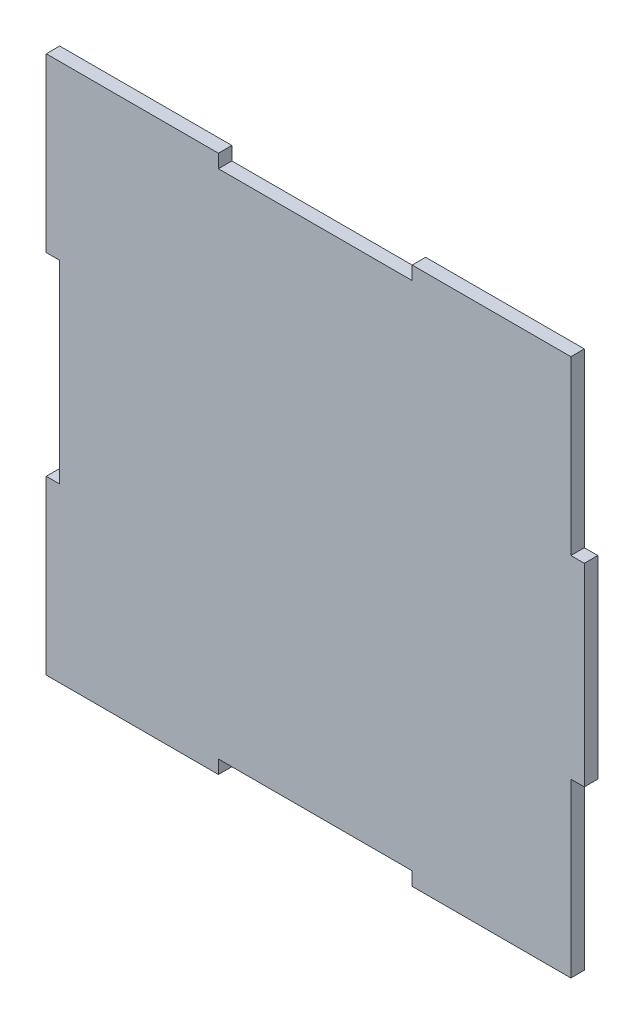
ISO-10303-21;
HEADER;
FILE_DESCRIPTION(('STEP AP214'),'2;1');
FILE_NAME('part.step','',(''),(''),'','','');
FILE_SCHEMA(('AUTOMOTIVE_DESIGN { 1 0 10303 214 1 1 1 1 }'));
ENDSEC;
DATA;
#1=APPLICATION_CONTEXT('core data for automotive mechanical design processes');
#2=APPLICATION_PROTOCOL_DEFINITION('international standard','automotive_design',2000,#1);
#3=PRODUCT_CONTEXT('',#1,'mechanical');
#4=PRODUCT('Part','Part','',(#3));
#5=PRODUCT_RELATED_PRODUCT_CATEGORY('part','',(#4));
#6=PRODUCT_DEFINITION_FORMATION('','',#4);
#7=PRODUCT_DEFINITION_CONTEXT('part definition',#1,'design');
#8=PRODUCT_DEFINITION('design','',#6,#7);
#9=PRODUCT_DEFINITION_SHAPE('','',#8);
#10=(LENGTH_UNIT() NAMED_UNIT(*) SI_UNIT(.MILLI.,.METRE.));
#11=(NAMED_UNIT(*) PLANE_ANGLE_UNIT() SI_UNIT($,.RADIAN.));
#12=(NAMED_UNIT(*) SI_UNIT($,.STERADIAN.) SOLID_ANGLE_UNIT());
#13=UNCERTAINTY_MEASURE_WITH_UNIT(LENGTH_MEASURE(1.E-05),#10,'distance_accuracy_value','');
#14=(GEOMETRIC_REPRESENTATION_CONTEXT(3) GLOBAL_UNCERTAINTY_ASSIGNED_CONTEXT((#13)) GLOBAL_UNIT_ASSIGNED_CONTEXT((#10,
#11,#12)) REPRESENTATION_CONTEXT('',''));
#15=CARTESIAN_POINT('',(0.,0.,0.));
#16=DIRECTION('',(0.,0.,1.));
#17=DIRECTION('',(1.,0.,0.));
#18=AXIS2_PLACEMENT_3D('',#15,#16,#17);
#19=CARTESIAN_POINT('',(-100.,100.,5.));
#20=DIRECTION('',(1.,0.,0.));
#21=DIRECTION('',(0.,0.,-1.));
#22=AXIS2_PLACEMENT_3D('',#19,#20,#21);
#23=PLANE('',#22);
#24=DIRECTION('',(0.,-1.,0.));
#25=VECTOR('',#24,1.);
#26=CARTESIAN_POINT('',(-100.,100.,0.));
#27=LINE('',#26,#25);
#28=CARTESIAN_POINT('',(-100.,100.,0.));
#29=VERTEX_POINT('',#28);
#30=CARTESIAN_POINT('',(-100.,36.,0.));
#31=VERTEX_POINT('',#30);
#32=EDGE_CURVE('E207',#29,#31,#27,.T.);
#33=ORIENTED_EDGE('',*,*,#32,.T.);
#34=DIRECTION('',(0.,0.,-1.));
#35=VECTOR('',#34,1.);
#36=CARTESIAN_POINT('',(-100.,36.,5.));
#37=LINE('',#36,#35);
#38=CARTESIAN_POINT('',(-100.,36.,5.));
#39=VERTEX_POINT('',#38);
#40=EDGE_CURVE('E11',#39,#31,#37,.T.);
#41=ORIENTED_EDGE('',*,*,#40,.F.);
#42=DIRECTION('',(0.,-1.,0.));
#43=VECTOR('',#42,1.);
#44=CARTESIAN_POINT('',(-100.,100.,5.));
#45=LINE('',#44,#43);
#46=CARTESIAN_POINT('',(-100.,100.,5.));
#47=VERTEX_POINT('',#46);
#48=EDGE_CURVE('E245',#47,#39,#45,.T.);
#49=ORIENTED_EDGE('',*,*,#48,.F.);
#50=DIRECTION('',(0.,0.,-1.));
#51=VECTOR('',#50,1.);
#52=CARTESIAN_POINT('',(-100.,100.,5.));
#53=LINE('',#52,#51);
#54=EDGE_CURVE('E203',#47,#29,#53,.T.);
#55=ORIENTED_EDGE('',*,*,#54,.T.);
#56=EDGE_LOOP('',(#33,#41,#49,#55));
#57=FACE_BOUND('',#56,.T.);
#58=ADVANCED_FACE('F39',(#57),#23,.F.);
#59=CARTESIAN_POINT('',(-100.,36.,5.));
#60=DIRECTION('',(0.,1.,0.));
#61=DIRECTION('',(0.,0.,1.));
#62=AXIS2_PLACEMENT_3D('',#59,#60,#61);
#63=PLANE('',#62);
#64=DIRECTION('',(1.,0.,0.));
#65=VECTOR('',#64,1.);
#66=CARTESIAN_POINT('',(-100.,36.,0.));
#67=LINE('',#66,#65);
#68=CARTESIAN_POINT('',(-95.,36.,0.));
#69=VERTEX_POINT('',#68);
#70=EDGE_CURVE('E210',#31,#69,#67,.T.);
#71=ORIENTED_EDGE('',*,*,#70,.T.);
#72=DIRECTION('',(0.,0.,-1.));
#73=VECTOR('',#72,1.);
#74=CARTESIAN_POINT('',(-95.,36.,5.));
#75=LINE('',#74,#73);
#76=CARTESIAN_POINT('',(-95.,36.,5.));
#77=VERTEX_POINT('',#76);
#78=EDGE_CURVE('E47',#77,#69,#75,.T.);
#79=ORIENTED_EDGE('',*,*,#78,.F.);
#80=DIRECTION('',(1.,0.,0.));
#81=VECTOR('',#80,1.);
#82=CARTESIAN_POINT('',(-100.,36.,5.));
#83=LINE('',#82,#81);
#84=EDGE_CURVE('E134',#39,#77,#83,.T.);
#85=ORIENTED_EDGE('',*,*,#84,.F.);
#86=ORIENTED_EDGE('',*,*,#40,.T.);
#87=EDGE_LOOP('',(#71,#79,#85,#86));
#88=FACE_BOUND('',#87,.T.);
#89=ADVANCED_FACE('F363',(#88),#63,.F.);
#90=CARTESIAN_POINT('',(-95.,36.,5.));
#91=DIRECTION('',(1.,0.,0.));
#92=DIRECTION('',(0.,0.,-1.));
#93=AXIS2_PLACEMENT_3D('',#90,#91,#92);
#94=PLANE('',#93);
#95=DIRECTION('',(0.,-1.,0.));
#96=VECTOR('',#95,1.);
#97=CARTESIAN_POINT('',(-95.,36.,0.));
#98=LINE('',#97,#96);
#99=CARTESIAN_POINT('',(-95.,-36.,0.));
#100=VERTEX_POINT('',#99);
#101=EDGE_CURVE('E212',#69,#100,#98,.T.);
#102=ORIENTED_EDGE('',*,*,#101,.T.);
#103=DIRECTION('',(0.,0.,-1.));
#104=VECTOR('',#103,1.);
#105=CARTESIAN_POINT('',(-95.,-36.,5.));
#106=LINE('',#105,#104);
#107=CARTESIAN_POINT('',(-95.,-36.,5.));
#108=VERTEX_POINT('',#107);
#109=EDGE_CURVE('E288',#108,#100,#106,.T.);
#110=ORIENTED_EDGE('',*,*,#109,.F.);
#111=DIRECTION('',(0.,-1.,0.));
#112=VECTOR('',#111,1.);
#113=CARTESIAN_POINT('',(-95.,36.,5.));
#114=LINE('',#113,#112);
#115=EDGE_CURVE('E296',#77,#108,#114,.T.);
#116=ORIENTED_EDGE('',*,*,#115,.F.);
#117=ORIENTED_EDGE('',*,*,#78,.T.);
#118=EDGE_LOOP('',(#102,#110,#116,#117));
#119=FACE_BOUND('',#118,.T.);
#120=ADVANCED_FACE('F294',(#119),#94,.F.);
#121=CARTESIAN_POINT('',(-95.,-36.,5.));
#122=DIRECTION('',(0.,-1.,0.));
#123=DIRECTION('',(0.,0.,-1.));
#124=AXIS2_PLACEMENT_3D('',#121,#122,#123);
#125=PLANE('',#124);
#126=DIRECTION('',(-1.,0.,0.));
#127=VECTOR('',#126,1.);
#128=CARTESIAN_POINT('',(-95.,-36.,0.));
#129=LINE('',#128,#127);
#130=CARTESIAN_POINT('',(-100.,-36.,0.));
#131=VERTEX_POINT('',#130);
#132=EDGE_CURVE('E214',#100,#131,#129,.T.);
#133=ORIENTED_EDGE('',*,*,#132,.T.);
#134=DIRECTION('',(0.,0.,-1.));
#135=VECTOR('',#134,1.);
#136=CARTESIAN_POINT('',(-100.,-36.,5.));
#137=LINE('',#136,#135);
#138=CARTESIAN_POINT('',(-100.,-36.,5.));
#139=VERTEX_POINT('',#138);
#140=EDGE_CURVE('E285',#139,#131,#137,.T.);
#141=ORIENTED_EDGE('',*,*,#140,.F.);
#142=DIRECTION('',(-1.,0.,0.));
#143=VECTOR('',#142,1.);
#144=CARTESIAN_POINT('',(-95.,-36.,5.));
#145=LINE('',#144,#143);
#146=EDGE_CURVE('E314',#108,#139,#145,.T.);
#147=ORIENTED_EDGE('',*,*,#146,.F.);
#148=ORIENTED_EDGE('',*,*,#109,.T.);
#149=EDGE_LOOP('',(#133,#141,#147,#148));
#150=FACE_BOUND('',#149,.T.);
#151=ADVANCED_FACE('F305',(#150),#125,.F.);
#152=CARTESIAN_POINT('',(-100.,-36.,5.));
#153=DIRECTION('',(1.,0.,0.));
#154=DIRECTION('',(0.,0.,-1.));
#155=AXIS2_PLACEMENT_3D('',#152,#153,#154);
#156=PLANE('',#155);
#157=DIRECTION('',(0.,-1.,0.));
#158=VECTOR('',#157,1.);
#159=CARTESIAN_POINT('',(-100.,-36.,0.));
#160=LINE('',#159,#158);
#161=CARTESIAN_POINT('',(-100.,-100.,0.));
#162=VERTEX_POINT('',#161);
#163=EDGE_CURVE('E216',#131,#162,#160,.T.);
#164=ORIENTED_EDGE('',*,*,#163,.T.);
#165=DIRECTION('',(0.,0.,-1.));
#166=VECTOR('',#165,1.);
#167=CARTESIAN_POINT('',(-100.,-100.,5.));
#168=LINE('',#167,#166);
#169=CARTESIAN_POINT('',(-100.,-100.,5.));
#170=VERTEX_POINT('',#169);
#171=EDGE_CURVE('E282',#170,#162,#168,.T.);
#172=ORIENTED_EDGE('',*,*,#171,.F.);
#173=DIRECTION('',(0.,-1.,0.));
#174=VECTOR('',#173,1.);
#175=CARTESIAN_POINT('',(-100.,-36.,5.));
#176=LINE('',#175,#174);
#177=EDGE_CURVE('E311',#139,#170,#176,.T.);
#178=ORIENTED_EDGE('',*,*,#177,.F.);
#179=ORIENTED_EDGE('',*,*,#140,.T.);
#180=EDGE_LOOP('',(#164,#172,#178,#179));
#181=FACE_BOUND('',#180,.T.);
#182=ADVANCED_FACE('F309',(#181),#156,.F.);
#183=CARTESIAN_POINT('',(-100.,-100.,5.));
#184=DIRECTION('',(0.,1.,0.));
#185=DIRECTION('',(0.,0.,1.));
#186=AXIS2_PLACEMENT_3D('',#183,#184,#185);
#187=PLANE('',#186);
#188=DIRECTION('',(1.,0.,0.));
#189=VECTOR('',#188,1.);
#190=CARTESIAN_POINT('',(-100.,-100.,0.));
#191=LINE('',#190,#189);
#192=CARTESIAN_POINT('',(-36.,-100.,0.));
#193=VERTEX_POINT('',#192);
#194=EDGE_CURVE('E218',#162,#193,#191,.T.);
#195=ORIENTED_EDGE('',*,*,#194,.T.);
#196=DIRECTION('',(0.,0.,-1.));
#197=VECTOR('',#196,1.);
#198=CARTESIAN_POINT('',(-36.,-100.,5.));
#199=LINE('',#198,#197);
#200=CARTESIAN_POINT('',(-36.,-100.,5.));
#201=VERTEX_POINT('',#200);
#202=EDGE_CURVE('E279',#201,#193,#199,.T.);
#203=ORIENTED_EDGE('',*,*,#202,.F.);
#204=DIRECTION('',(1.,0.,0.));
#205=VECTOR('',#204,1.);
#206=CARTESIAN_POINT('',(-100.,-100.,5.));
#207=LINE('',#206,#205);
#208=EDGE_CURVE('E313',#170,#201,#207,.T.);
#209=ORIENTED_EDGE('',*,*,#208,.F.);
#210=ORIENTED_EDGE('',*,*,#171,.T.);
#211=EDGE_LOOP('',(#195,#203,#209,#210));
#212=FACE_BOUND('',#211,.T.);
#213=ADVANCED_FACE('F376',(#212),#187,.F.);
#214=CARTESIAN_POINT('',(-36.,-100.,5.));
#215=DIRECTION('',(-1.,0.,0.));
#216=DIRECTION('',(0.,-1.,0.));
#217=AXIS2_PLACEMENT_3D('',#214,#215,#216);
#218=PLANE('',#217);
#219=DIRECTION('',(0.,1.,0.));
#220=VECTOR('',#219,1.);
#221=CARTESIAN_POINT('',(-36.,-100.,0.));
#222=LINE('',#221,#220);
#223=CARTESIAN_POINT('',(-36.,-95.,0.));
#224=VERTEX_POINT('',#223);
#225=EDGE_CURVE('E220',#193,#224,#222,.T.);
#226=ORIENTED_EDGE('',*,*,#225,.T.);
#227=DIRECTION('',(0.,0.,-1.));
#228=VECTOR('',#227,1.);
#229=CARTESIAN_POINT('',(-36.,-95.,5.));
#230=LINE('',#229,#228);
#231=CARTESIAN_POINT('',(-36.,-95.,5.));
#232=VERTEX_POINT('',#231);
#233=EDGE_CURVE('E276',#232,#224,#230,.T.);
#234=ORIENTED_EDGE('',*,*,#233,.F.);
#235=DIRECTION('',(0.,1.,0.));
#236=VECTOR('',#235,1.);
#237=CARTESIAN_POINT('',(-36.,-100.,5.));
#238=LINE('',#237,#236);
#239=EDGE_CURVE('E316',#201,#232,#238,.T.);
#240=ORIENTED_EDGE('',*,*,#239,.F.);
#241=ORIENTED_EDGE('',*,*,#202,.T.);
#242=EDGE_LOOP('',(#226,#234,#240,#241));
#243=FACE_BOUND('',#242,.T.);
#244=ADVANCED_FACE('F379',(#243),#218,.F.);
#245=CARTESIAN_POINT('',(-36.,-95.,5.));
#246=DIRECTION('',(0.,1.,0.));
#247=DIRECTION('',(0.,0.,1.));
#248=AXIS2_PLACEMENT_3D('',#245,#246,#247);
#249=PLANE('',#248);
#250=DIRECTION('',(1.,0.,0.));
#251=VECTOR('',#250,1.);
#252=CARTESIAN_POINT('',(-36.,-95.,0.));
#253=LINE('',#252,#251);
#254=CARTESIAN_POINT('',(36.,-95.,0.));
#255=VERTEX_POINT('',#254);
#256=EDGE_CURVE('E222',#224,#255,#253,.T.);
#257=ORIENTED_EDGE('',*,*,#256,.T.);
#258=DIRECTION('',(0.,0.,-1.));
#259=VECTOR('',#258,1.);
#260=CARTESIAN_POINT('',(36.,-95.,5.));
#261=LINE('',#260,#259);
#262=CARTESIAN_POINT('',(36.,-95.,5.));
#263=VERTEX_POINT('',#262);
#264=EDGE_CURVE('E273',#263,#255,#261,.T.);
#265=ORIENTED_EDGE('',*,*,#264,.F.);
#266=DIRECTION('',(1.,0.,0.));
#267=VECTOR('',#266,1.);
#268=CARTESIAN_POINT('',(-36.,-95.,5.));
#269=LINE('',#268,#267);
#270=EDGE_CURVE('E322',#232,#263,#269,.T.);
#271=ORIENTED_EDGE('',*,*,#270,.F.);
#272=ORIENTED_EDGE('',*,*,#233,.T.);
#273=EDGE_LOOP('',(#257,#265,#271,#272));
#274=FACE_BOUND('',#273,.T.);
#275=ADVANCED_FACE('F383',(#274),#249,.F.);
#276=CARTESIAN_POINT('',(36.,-100.,5.));
#277=DIRECTION('',(1.,0.,0.));
#278=DIRECTION('',(0.,1.,0.));
#279=AXIS2_PLACEMENT_3D('',#276,#277,#278);
#280=PLANE('',#279);
#281=DIRECTION('',(0.,-1.,0.));
#282=VECTOR('',#281,1.);
#283=CARTESIAN_POINT('',(36.,-100.,0.));
#284=LINE('',#283,#282);
#285=CARTESIAN_POINT('',(36.,-100.,0.));
#286=VERTEX_POINT('',#285);
#287=EDGE_CURVE('E224',#255,#286,#284,.T.);
#288=ORIENTED_EDGE('',*,*,#287,.T.);
#289=DIRECTION('',(0.,0.,-1.));
#290=VECTOR('',#289,1.);
#291=CARTESIAN_POINT('',(36.,-100.,5.));
#292=LINE('',#291,#290);
#293=CARTESIAN_POINT('',(36.,-100.,5.));
#294=VERTEX_POINT('',#293);
#295=EDGE_CURVE('E270',#294,#286,#292,.T.);
#296=ORIENTED_EDGE('',*,*,#295,.F.);
#297=DIRECTION('',(0.,-1.,0.));
#298=VECTOR('',#297,1.);
#299=CARTESIAN_POINT('',(36.,-100.,5.));
#300=LINE('',#299,#298);
#301=EDGE_CURVE('E324',#263,#294,#300,.T.);
#302=ORIENTED_EDGE('',*,*,#301,.F.);
#303=ORIENTED_EDGE('',*,*,#264,.T.);
#304=EDGE_LOOP('',(#288,#296,#302,#303));
#305=FACE_BOUND('',#304,.T.);
#306=ADVANCED_FACE('F387',(#305),#280,.F.);
#307=CARTESIAN_POINT('',(95.,-100.,5.));
#308=DIRECTION('',(0.,1.,0.));
#309=DIRECTION('',(-1.,0.,0.));
#310=AXIS2_PLACEMENT_3D('',#307,#308,#309);
#311=PLANE('',#310);
#312=DIRECTION('',(1.,0.,0.));
#313=VECTOR('',#312,1.);
#314=CARTESIAN_POINT('',(95.,-100.,0.));
#315=LINE('',#314,#313);
#316=CARTESIAN_POINT('',(95.,-100.,0.));
#317=VERTEX_POINT('',#316);
#318=EDGE_CURVE('E226',#286,#317,#315,.T.);
#319=ORIENTED_EDGE('',*,*,#318,.T.);
#320=DIRECTION('',(0.,0.,-1.));
#321=VECTOR('',#320,1.);
#322=CARTESIAN_POINT('',(95.,-100.,5.));
#323=LINE('',#322,#321);
#324=CARTESIAN_POINT('',(95.,-100.,5.));
#325=VERTEX_POINT('',#324);
#326=EDGE_CURVE('E267',#325,#317,#323,.T.);
#327=ORIENTED_EDGE('',*,*,#326,.F.);
#328=DIRECTION('',(1.,0.,0.));
#329=VECTOR('',#328,1.);
#330=CARTESIAN_POINT('',(95.,-100.,5.));
#331=LINE('',#330,#329);
#332=EDGE_CURVE('E326',#294,#325,#331,.T.);
#333=ORIENTED_EDGE('',*,*,#332,.F.);
#334=ORIENTED_EDGE('',*,*,#295,.T.);
#335=EDGE_LOOP('',(#319,#327,#333,#334));
#336=FACE_BOUND('',#335,.T.);
#337=ADVANCED_FACE('F391',(#336),#311,.F.);
#338=CARTESIAN_POINT('',(95.,-36.,5.));
#339=DIRECTION('',(-1.,0.,0.));
#340=DIRECTION('',(0.,-1.,0.));
#341=AXIS2_PLACEMENT_3D('',#338,#339,#340);
#342=PLANE('',#341);
#343=DIRECTION('',(0.,1.,0.));
#344=VECTOR('',#343,1.);
#345=CARTESIAN_POINT('',(95.,-36.,0.));
#346=LINE('',#345,#344);
#347=CARTESIAN_POINT('',(95.,-36.,0.));
#348=VERTEX_POINT('',#347);
#349=EDGE_CURVE('E228',#317,#348,#346,.T.);
#350=ORIENTED_EDGE('',*,*,#349,.T.);
#351=DIRECTION('',(0.,0.,-1.));
#352=VECTOR('',#351,1.);
#353=CARTESIAN_POINT('',(95.,-36.,5.));
#354=LINE('',#353,#352);
#355=CARTESIAN_POINT('',(95.,-36.,5.));
#356=VERTEX_POINT('',#355);
#357=EDGE_CURVE('E264',#356,#348,#354,.T.);
#358=ORIENTED_EDGE('',*,*,#357,.F.);
#359=DIRECTION('',(0.,1.,0.));
#360=VECTOR('',#359,1.);
#361=CARTESIAN_POINT('',(95.,-36.,5.));
#362=LINE('',#361,#360);
#363=EDGE_CURVE('E328',#325,#356,#362,.T.);
#364=ORIENTED_EDGE('',*,*,#363,.F.);
#365=ORIENTED_EDGE('',*,*,#326,.T.);
#366=EDGE_LOOP('',(#350,#358,#364,#365));
#367=FACE_BOUND('',#366,.T.);
#368=ADVANCED_FACE('F395',(#367),#342,.F.);
#369=CARTESIAN_POINT('',(100.,-36.,5.));
#370=DIRECTION('',(0.,1.,0.));
#371=DIRECTION('',(0.,0.,1.));
#372=AXIS2_PLACEMENT_3D('',#369,#370,#371);
#373=PLANE('',#372);
#374=DIRECTION('',(1.,0.,0.));
#375=VECTOR('',#374,1.);
#376=CARTESIAN_POINT('',(100.,-36.,0.));
#377=LINE('',#376,#375);
#378=CARTESIAN_POINT('',(100.,-36.,0.));
#379=VERTEX_POINT('',#378);
#380=EDGE_CURVE('E230',#348,#379,#377,.T.);
#381=ORIENTED_EDGE('',*,*,#380,.T.);
#382=DIRECTION('',(0.,0.,-1.));
#383=VECTOR('',#382,1.);
#384=CARTESIAN_POINT('',(100.,-36.,5.));
#385=LINE('',#384,#383);
#386=CARTESIAN_POINT('',(100.,-36.,5.));
#387=VERTEX_POINT('',#386);
#388=EDGE_CURVE('E261',#387,#379,#385,.T.);
#389=ORIENTED_EDGE('',*,*,#388,.F.);
#390=DIRECTION('',(1.,0.,0.));
#391=VECTOR('',#390,1.);
#392=CARTESIAN_POINT('',(100.,-36.,5.));
#393=LINE('',#392,#391);
#394=EDGE_CURVE('E330',#356,#387,#393,.T.);
#395=ORIENTED_EDGE('',*,*,#394,.F.);
#396=ORIENTED_EDGE('',*,*,#357,.T.);
#397=EDGE_LOOP('',(#381,#389,#395,#396));
#398=FACE_BOUND('',#397,.T.);
#399=ADVANCED_FACE('F399',(#398),#373,.F.);
#400=CARTESIAN_POINT('',(100.,36.,5.));
#401=DIRECTION('',(-1.,0.,0.));
#402=DIRECTION('',(0.,0.,1.));
#403=AXIS2_PLACEMENT_3D('',#400,#401,#402);
#404=PLANE('',#403);
#405=DIRECTION('',(0.,1.,0.));
#406=VECTOR('',#405,1.);
#407=CARTESIAN_POINT('',(100.,36.,0.));
#408=LINE('',#407,#406);
#409=CARTESIAN_POINT('',(100.,36.,0.));
#410=VERTEX_POINT('',#409);
#411=EDGE_CURVE('E232',#379,#410,#408,.T.);
#412=ORIENTED_EDGE('',*,*,#411,.T.);
#413=DIRECTION('',(0.,0.,-1.));
#414=VECTOR('',#413,1.);
#415=CARTESIAN_POINT('',(100.,36.,5.));
#416=LINE('',#415,#414);
#417=CARTESIAN_POINT('',(100.,36.,5.));
#418=VERTEX_POINT('',#417);
#419=EDGE_CURVE('E258',#418,#410,#416,.T.);
#420=ORIENTED_EDGE('',*,*,#419,.F.);
#421=DIRECTION('',(0.,1.,0.));
#422=VECTOR('',#421,1.);
#423=CARTESIAN_POINT('',(100.,36.,5.));
#424=LINE('',#423,#422);
#425=EDGE_CURVE('E332',#387,#418,#424,.T.);
#426=ORIENTED_EDGE('',*,*,#425,.F.);
#427=ORIENTED_EDGE('',*,*,#388,.T.);
#428=EDGE_LOOP('',(#412,#420,#426,#427));
#429=FACE_BOUND('',#428,.T.);
#430=ADVANCED_FACE('F403',(#429),#404,.F.);
#431=CARTESIAN_POINT('',(95.,36.,5.));
#432=DIRECTION('',(0.,-1.,0.));
#433=DIRECTION('',(0.,0.,-1.));
#434=AXIS2_PLACEMENT_3D('',#431,#432,#433);
#435=PLANE('',#434);
#436=DIRECTION('',(-1.,0.,0.));
#437=VECTOR('',#436,1.);
#438=CARTESIAN_POINT('',(95.,36.,0.));
#439=LINE('',#438,#437);
#440=CARTESIAN_POINT('',(95.,36.,0.));
#441=VERTEX_POINT('',#440);
#442=EDGE_CURVE('E234',#410,#441,#439,.T.);
#443=ORIENTED_EDGE('',*,*,#442,.T.);
#444=DIRECTION('',(0.,0.,-1.));
#445=VECTOR('',#444,1.);
#446=CARTESIAN_POINT('',(95.,36.,5.));
#447=LINE('',#446,#445);
#448=CARTESIAN_POINT('',(95.,36.,5.));
#449=VERTEX_POINT('',#448);
#450=EDGE_CURVE('E255',#449,#441,#447,.T.);
#451=ORIENTED_EDGE('',*,*,#450,.F.);
#452=DIRECTION('',(-1.,0.,0.));
#453=VECTOR('',#452,1.);
#454=CARTESIAN_POINT('',(95.,36.,5.));
#455=LINE('',#454,#453);
#456=EDGE_CURVE('E334',#418,#449,#455,.T.);
#457=ORIENTED_EDGE('',*,*,#456,.F.);
#458=ORIENTED_EDGE('',*,*,#419,.T.);
#459=EDGE_LOOP('',(#443,#451,#457,#458));
#460=FACE_BOUND('',#459,.T.);
#461=ADVANCED_FACE('F407',(#460),#435,.F.);
#462=CARTESIAN_POINT('',(95.,100.,5.));
#463=DIRECTION('',(-1.,0.,0.));
#464=DIRECTION('',(0.,-1.,0.));
#465=AXIS2_PLACEMENT_3D('',#462,#463,#464);
#466=PLANE('',#465);
#467=DIRECTION('',(0.,1.,0.));
#468=VECTOR('',#467,1.);
#469=CARTESIAN_POINT('',(95.,100.,0.));
#470=LINE('',#469,#468);
#471=CARTESIAN_POINT('',(95.,100.,0.));
#472=VERTEX_POINT('',#471);
#473=EDGE_CURVE('E236',#441,#472,#470,.T.);
#474=ORIENTED_EDGE('',*,*,#473,.T.);
#475=DIRECTION('',(0.,0.,-1.));
#476=VECTOR('',#475,1.);
#477=CARTESIAN_POINT('',(95.,100.,5.));
#478=LINE('',#477,#476);
#479=CARTESIAN_POINT('',(95.,100.,5.));
#480=VERTEX_POINT('',#479);
#481=EDGE_CURVE('E252',#480,#472,#478,.T.);
#482=ORIENTED_EDGE('',*,*,#481,.F.);
#483=DIRECTION('',(0.,1.,0.));
#484=VECTOR('',#483,1.);
#485=CARTESIAN_POINT('',(95.,100.,5.));
#486=LINE('',#485,#484);
#487=EDGE_CURVE('E336',#449,#480,#486,.T.);
#488=ORIENTED_EDGE('',*,*,#487,.F.);
#489=ORIENTED_EDGE('',*,*,#450,.T.);
#490=EDGE_LOOP('',(#474,#482,#488,#489));
#491=FACE_BOUND('',#490,.T.);
#492=ADVANCED_FACE('F411',(#491),#466,.F.);
#493=CARTESIAN_POINT('',(36.,100.,5.));
#494=DIRECTION('',(0.,-1.,0.));
#495=DIRECTION('',(0.,0.,-1.));
#496=AXIS2_PLACEMENT_3D('',#493,#494,#495);
#497=PLANE('',#496);
#498=DIRECTION('',(-1.,0.,0.));
#499=VECTOR('',#498,1.);
#500=CARTESIAN_POINT('',(36.,100.,0.));
#501=LINE('',#500,#499);
#502=CARTESIAN_POINT('',(36.,100.,0.));
#503=VERTEX_POINT('',#502);
#504=EDGE_CURVE('E238',#472,#503,#501,.T.);
#505=ORIENTED_EDGE('',*,*,#504,.T.);
#506=DIRECTION('',(0.,0.,-1.));
#507=VECTOR('',#506,1.);
#508=CARTESIAN_POINT('',(36.,100.,5.));
#509=LINE('',#508,#507);
#510=CARTESIAN_POINT('',(36.,100.,5.));
#511=VERTEX_POINT('',#510);
#512=EDGE_CURVE('E249',#511,#503,#509,.T.);
#513=ORIENTED_EDGE('',*,*,#512,.F.);
#514=DIRECTION('',(-1.,0.,0.));
#515=VECTOR('',#514,1.);
#516=CARTESIAN_POINT('',(36.,100.,5.));
#517=LINE('',#516,#515);
#518=EDGE_CURVE('E338',#480,#511,#517,.T.);
#519=ORIENTED_EDGE('',*,*,#518,.F.);
#520=ORIENTED_EDGE('',*,*,#481,.T.);
#521=EDGE_LOOP('',(#505,#513,#519,#520));
#522=FACE_BOUND('',#521,.T.);
#523=ADVANCED_FACE('F344',(#522),#497,.F.);
#524=CARTESIAN_POINT('',(36.,95.,5.));
#525=DIRECTION('',(1.,0.,0.));
#526=DIRECTION('',(0.,0.,-1.));
#527=AXIS2_PLACEMENT_3D('',#524,#525,#526);
#528=PLANE('',#527);
#529=DIRECTION('',(0.,-1.,0.));
#530=VECTOR('',#529,1.);
#531=CARTESIAN_POINT('',(36.,95.,0.));
#532=LINE('',#531,#530);
#533=CARTESIAN_POINT('',(36.,95.,0.));
#534=VERTEX_POINT('',#533);
#535=EDGE_CURVE('E240',#503,#534,#532,.T.);
#536=ORIENTED_EDGE('',*,*,#535,.T.);
#537=DIRECTION('',(0.,0.,-1.));
#538=VECTOR('',#537,1.);
#539=CARTESIAN_POINT('',(36.,95.,5.));
#540=LINE('',#539,#538);
#541=CARTESIAN_POINT('',(36.,95.,5.));
#542=VERTEX_POINT('',#541);
#543=EDGE_CURVE('E198',#542,#534,#540,.T.);
#544=ORIENTED_EDGE('',*,*,#543,.F.);
#545=DIRECTION('',(0.,-1.,0.));
#546=VECTOR('',#545,1.);
#547=CARTESIAN_POINT('',(36.,95.,5.));
#548=LINE('',#547,#546);
#549=EDGE_CURVE('E189',#511,#542,#548,.T.);
#550=ORIENTED_EDGE('',*,*,#549,.F.);
#551=ORIENTED_EDGE('',*,*,#512,.T.);
#552=EDGE_LOOP('',(#536,#544,#550,#551));
#553=FACE_BOUND('',#552,.T.);
#554=ADVANCED_FACE('F348',(#553),#528,.F.);
#555=CARTESIAN_POINT('',(36.,95.,5.));
#556=DIRECTION('',(0.,-1.,0.));
#557=DIRECTION('',(0.,0.,-1.));
#558=AXIS2_PLACEMENT_3D('',#555,#556,#557);
#559=PLANE('',#558);
#560=DIRECTION('',(-1.,0.,0.));
#561=VECTOR('',#560,1.);
#562=CARTESIAN_POINT('',(36.,95.,0.));
#563=LINE('',#562,#561);
#564=CARTESIAN_POINT('',(-36.,95.,0.));
#565=VERTEX_POINT('',#564);
#566=EDGE_CURVE('E197',#534,#565,#563,.T.);
#567=ORIENTED_EDGE('',*,*,#566,.T.);
#568=DIRECTION('',(0.,0.,-1.));
#569=VECTOR('',#568,1.);
#570=CARTESIAN_POINT('',(-36.,95.,5.));
#571=LINE('',#570,#569);
#572=CARTESIAN_POINT('',(-36.,95.,5.));
#573=VERTEX_POINT('',#572);
#574=EDGE_CURVE('E194',#573,#565,#571,.T.);
#575=ORIENTED_EDGE('',*,*,#574,.F.);
#576=DIRECTION('',(-1.,0.,0.));
#577=VECTOR('',#576,1.);
#578=CARTESIAN_POINT('',(36.,95.,5.));
#579=LINE('',#578,#577);
#580=EDGE_CURVE('E183',#542,#573,#579,.T.);
#581=ORIENTED_EDGE('',*,*,#580,.F.);
#582=ORIENTED_EDGE('',*,*,#543,.T.);
#583=EDGE_LOOP('',(#567,#575,#581,#582));
#584=FACE_BOUND('',#583,.T.);
#585=ADVANCED_FACE('F195',(#584),#559,.F.);
#586=CARTESIAN_POINT('',(-36.,95.,5.));
#587=DIRECTION('',(-1.,0.,0.));
#588=DIRECTION('',(0.,0.,1.));
#589=AXIS2_PLACEMENT_3D('',#586,#587,#588);
#590=PLANE('',#589);
#591=DIRECTION('',(0.,1.,0.));
#592=VECTOR('',#591,1.);
#593=CARTESIAN_POINT('',(-36.,95.,0.));
#594=LINE('',#593,#592);
#595=CARTESIAN_POINT('',(-36.,100.,0.));
#596=VERTEX_POINT('',#595);
#597=EDGE_CURVE('E120',#565,#596,#594,.T.);
#598=ORIENTED_EDGE('',*,*,#597,.T.);
#599=DIRECTION('',(0.,0.,-1.));
#600=VECTOR('',#599,1.);
#601=CARTESIAN_POINT('',(-36.,100.,5.));
#602=LINE('',#601,#600);
#603=CARTESIAN_POINT('',(-36.,100.,5.));
#604=VERTEX_POINT('',#603);
#605=EDGE_CURVE('E199',#604,#596,#602,.T.);
#606=ORIENTED_EDGE('',*,*,#605,.F.);
#607=DIRECTION('',(0.,1.,0.));
#608=VECTOR('',#607,1.);
#609=CARTESIAN_POINT('',(-36.,95.,5.));
#610=LINE('',#609,#608);
#611=EDGE_CURVE('E187',#573,#604,#610,.T.);
#612=ORIENTED_EDGE('',*,*,#611,.F.);
#613=ORIENTED_EDGE('',*,*,#574,.T.);
#614=EDGE_LOOP('',(#598,#606,#612,#613));
#615=FACE_BOUND('',#614,.T.);
#616=ADVANCED_FACE('F201',(#615),#590,.F.);
#617=CARTESIAN_POINT('',(-36.,100.,5.));
#618=DIRECTION('',(0.,-1.,0.));
#619=DIRECTION('',(1.,0.,0.));
#620=AXIS2_PLACEMENT_3D('',#617,#618,#619);
#621=PLANE('',#620);
#622=DIRECTION('',(-1.,0.,0.));
#623=VECTOR('',#622,1.);
#624=CARTESIAN_POINT('',(-36.,100.,0.));
#625=LINE('',#624,#623);
#626=EDGE_CURVE('E126',#596,#29,#625,.T.);
#627=ORIENTED_EDGE('',*,*,#626,.T.);
#628=ORIENTED_EDGE('',*,*,#54,.F.);
#629=DIRECTION('',(-1.,0.,0.));
#630=VECTOR('',#629,1.);
#631=CARTESIAN_POINT('',(-36.,100.,5.));
#632=LINE('',#631,#630);
#633=EDGE_CURVE('E55',#604,#47,#632,.T.);
#634=ORIENTED_EDGE('',*,*,#633,.F.);
#635=ORIENTED_EDGE('',*,*,#605,.T.);
#636=EDGE_LOOP('',(#627,#628,#634,#635));
#637=FACE_BOUND('',#636,.T.);
#638=ADVANCED_FACE('F352',(#637),#621,.F.);
#639=CARTESIAN_POINT('',(0.,0.,5.));
#640=DIRECTION('',(0.,0.,1.));
#641=DIRECTION('',(1.,0.,0.));
#642=AXIS2_PLACEMENT_3D('',#639,#640,#641);
#643=PLANE('',#642);
#644=ORIENTED_EDGE('',*,*,#48,.T.);
#645=ORIENTED_EDGE('',*,*,#84,.T.);
#646=ORIENTED_EDGE('',*,*,#115,.T.);
#647=ORIENTED_EDGE('',*,*,#146,.T.);
#648=ORIENTED_EDGE('',*,*,#177,.T.);
#649=ORIENTED_EDGE('',*,*,#208,.T.);
#650=ORIENTED_EDGE('',*,*,#239,.T.);
#651=ORIENTED_EDGE('',*,*,#270,.T.);
#652=ORIENTED_EDGE('',*,*,#301,.T.);
#653=ORIENTED_EDGE('',*,*,#332,.T.);
#654=ORIENTED_EDGE('',*,*,#363,.T.);
#655=ORIENTED_EDGE('',*,*,#394,.T.);
#656=ORIENTED_EDGE('',*,*,#425,.T.);
#657=ORIENTED_EDGE('',*,*,#456,.T.);
#658=ORIENTED_EDGE('',*,*,#487,.T.);
#659=ORIENTED_EDGE('',*,*,#518,.T.);
#660=ORIENTED_EDGE('',*,*,#549,.T.);
#661=ORIENTED_EDGE('',*,*,#580,.T.);
#662=ORIENTED_EDGE('',*,*,#611,.T.);
#663=ORIENTED_EDGE('',*,*,#633,.T.);
#664=EDGE_LOOP('',(#644,#645,#646,#647,#648,#649,#650,#651,#652,#653,#654,#655,#656,#657,#658,
#659,#660,#661,#662,#663));
#665=FACE_BOUND('',#664,.T.);
#666=ADVANCED_FACE('F185',(#665),#643,.T.);
#667=CARTESIAN_POINT('',(0.,0.,0.));
#668=DIRECTION('',(0.,0.,1.));
#669=DIRECTION('',(1.,0.,0.));
#670=AXIS2_PLACEMENT_3D('',#667,#668,#669);
#671=PLANE('',#670);
#672=ORIENTED_EDGE('',*,*,#32,.F.);
#673=ORIENTED_EDGE('',*,*,#626,.F.);
#674=ORIENTED_EDGE('',*,*,#597,.F.);
#675=ORIENTED_EDGE('',*,*,#566,.F.);
#676=ORIENTED_EDGE('',*,*,#535,.F.);
#677=ORIENTED_EDGE('',*,*,#504,.F.);
#678=ORIENTED_EDGE('',*,*,#473,.F.);
#679=ORIENTED_EDGE('',*,*,#442,.F.);
#680=ORIENTED_EDGE('',*,*,#411,.F.);
#681=ORIENTED_EDGE('',*,*,#380,.F.);
#682=ORIENTED_EDGE('',*,*,#349,.F.);
#683=ORIENTED_EDGE('',*,*,#318,.F.);
#684=ORIENTED_EDGE('',*,*,#287,.F.);
#685=ORIENTED_EDGE('',*,*,#256,.F.);
#686=ORIENTED_EDGE('',*,*,#225,.F.);
#687=ORIENTED_EDGE('',*,*,#194,.F.);
#688=ORIENTED_EDGE('',*,*,#163,.F.);
#689=ORIENTED_EDGE('',*,*,#132,.F.);
#690=ORIENTED_EDGE('',*,*,#101,.F.);
#691=ORIENTED_EDGE('',*,*,#70,.F.);
#692=EDGE_LOOP('',(#672,#673,#674,#675,#676,#677,#678,#679,#680,#681,#682,#683,#684,#685,#686,
#687,#688,#689,#690,#691));
#693=FACE_BOUND('',#692,.T.);
#694=ADVANCED_FACE('F300',(#693),#671,.F.);
#695=CLOSED_SHELL('',(#58,#89,#120,#151,#182,#213,#244,#275,#306,#337,#368,#399,#430,#461,#492,
#523,#554,#585,#616,#638,#666,#694));
#696=MANIFOLD_SOLID_BREP('B2',#695);
#697=ADVANCED_BREP_SHAPE_REPRESENTATION('',(#18,#696),#14);
#698=SHAPE_DEFINITION_REPRESENTATION(#9,#697);
ENDSEC;
END-ISO-10303-21;
